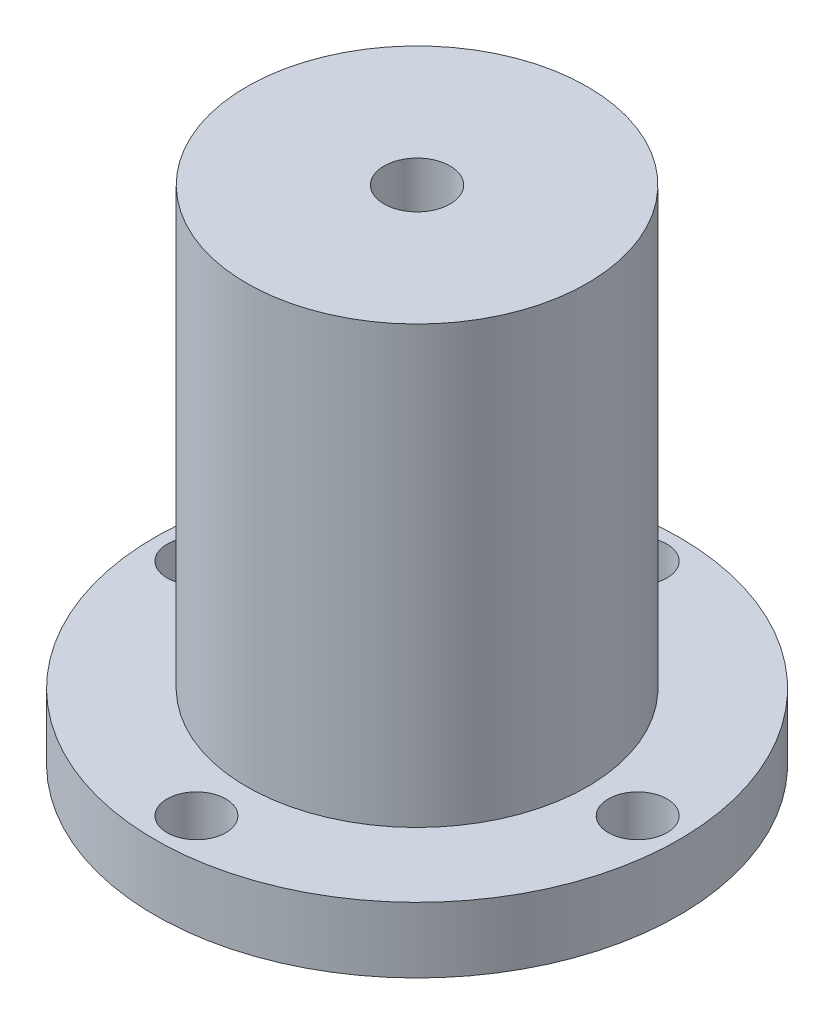
ISO-10303-21;
HEADER;
FILE_DESCRIPTION(('STEP AP214'),'2;1');
FILE_NAME('part.step','',(''),(''),'','','');
FILE_SCHEMA(('AUTOMOTIVE_DESIGN { 1 0 10303 214 1 1 1 1 }'));
ENDSEC;
DATA;
#1=APPLICATION_CONTEXT('core data for automotive mechanical design processes');
#2=APPLICATION_PROTOCOL_DEFINITION('international standard','automotive_design',2000,#1);
#3=PRODUCT_CONTEXT('',#1,'mechanical');
#4=PRODUCT('Part','Part','',(#3));
#5=PRODUCT_RELATED_PRODUCT_CATEGORY('part','',(#4));
#6=PRODUCT_DEFINITION_FORMATION('','',#4);
#7=PRODUCT_DEFINITION_CONTEXT('part definition',#1,'design');
#8=PRODUCT_DEFINITION('design','',#6,#7);
#9=PRODUCT_DEFINITION_SHAPE('','',#8);
#10=(LENGTH_UNIT() NAMED_UNIT(*) SI_UNIT(.MILLI.,.METRE.));
#11=(NAMED_UNIT(*) PLANE_ANGLE_UNIT() SI_UNIT($,.RADIAN.));
#12=(NAMED_UNIT(*) SI_UNIT($,.STERADIAN.) SOLID_ANGLE_UNIT());
#13=UNCERTAINTY_MEASURE_WITH_UNIT(LENGTH_MEASURE(1.E-05),#10,'distance_accuracy_value','');
#14=(GEOMETRIC_REPRESENTATION_CONTEXT(3) GLOBAL_UNCERTAINTY_ASSIGNED_CONTEXT((#13)) GLOBAL_UNIT_ASSIGNED_CONTEXT((#10,
#11,#12)) REPRESENTATION_CONTEXT('',''));
#15=CARTESIAN_POINT('',(0.,0.,0.));
#16=DIRECTION('',(0.,0.,1.));
#17=DIRECTION('',(1.,0.,0.));
#18=AXIS2_PLACEMENT_3D('',#15,#16,#17);
#19=CARTESIAN_POINT('',(12.7,0.,0.));
#20=DIRECTION('',(0.,-1.,0.));
#21=DIRECTION('',(0.,0.,-1.));
#22=AXIS2_PLACEMENT_3D('',#19,#20,#21);
#23=PLANE('',#22);
#24=CARTESIAN_POINT('',(0.,0.,0.));
#25=DIRECTION('',(0.,-1.,0.));
#26=DIRECTION('',(0.,0.,-1.));
#27=AXIS2_PLACEMENT_3D('',#24,#25,#26);
#28=CIRCLE('',#27,5.6007);
#29=CARTESIAN_POINT('',(0.,0.,-5.6007));
#30=VERTEX_POINT('',#29);
#31=EDGE_CURVE('E59',#30,#30,#28,.T.);
#32=ORIENTED_EDGE('',*,*,#31,.F.);
#33=EDGE_LOOP('',(#32));
#34=FACE_BOUND('',#33,.T.);
#35=CARTESIAN_POINT('',(0.,0.,-10.6934));
#36=DIRECTION('',(0.,1.,0.));
#37=DIRECTION('',(0.,0.,1.));
#38=AXIS2_PLACEMENT_3D('',#35,#36,#37);
#39=CIRCLE('',#38,1.4224);
#40=CARTESIAN_POINT('',(0.,0.,-9.271));
#41=VERTEX_POINT('',#40);
#42=EDGE_CURVE('E34',#41,#41,#39,.T.);
#43=ORIENTED_EDGE('',*,*,#42,.T.);
#44=EDGE_LOOP('',(#43));
#45=FACE_BOUND('',#44,.T.);
#46=CARTESIAN_POINT('',(10.6934000000003,0.,-3.02615143814882E-13));
#47=DIRECTION('',(0.,1.,0.));
#48=DIRECTION('',(0.,0.,1.));
#49=AXIS2_PLACEMENT_3D('',#46,#47,#48);
#50=CIRCLE('',#49,1.42240000000024);
#51=CARTESIAN_POINT('',(10.6934000000003,0.,1.42239999999993));
#52=VERTEX_POINT('',#51);
#53=EDGE_CURVE('E51',#52,#52,#50,.T.);
#54=ORIENTED_EDGE('',*,*,#53,.T.);
#55=EDGE_LOOP('',(#54));
#56=FACE_BOUND('',#55,.T.);
#57=CARTESIAN_POINT('',(6.05230287629764E-13,0.,10.6934));
#58=DIRECTION('',(0.,1.,0.));
#59=DIRECTION('',(0.,0.,1.));
#60=AXIS2_PLACEMENT_3D('',#57,#58,#59);
#61=CIRCLE('',#60,1.42240000000065);
#62=CARTESIAN_POINT('',(6.05230287629764E-13,0.,12.1158000000007));
#63=VERTEX_POINT('',#62);
#64=EDGE_CURVE('E45',#63,#63,#61,.T.);
#65=ORIENTED_EDGE('',*,*,#64,.T.);
#66=EDGE_LOOP('',(#65));
#67=FACE_BOUND('',#66,.T.);
#68=CARTESIAN_POINT('',(-10.6933999999997,0.,3.03924707623082E-13));
#69=DIRECTION('',(0.,1.,0.));
#70=DIRECTION('',(0.,0.,1.));
#71=AXIS2_PLACEMENT_3D('',#68,#69,#70);
#72=CIRCLE('',#71,1.42240000000049);
#73=CARTESIAN_POINT('',(-10.6933999999997,0.,1.42240000000079));
#74=VERTEX_POINT('',#73);
#75=EDGE_CURVE('E38',#74,#74,#72,.T.);
#76=ORIENTED_EDGE('',*,*,#75,.T.);
#77=EDGE_LOOP('',(#76));
#78=FACE_BOUND('',#77,.T.);
#79=CARTESIAN_POINT('',(0.,0.,0.));
#80=DIRECTION('',(0.,-1.,0.));
#81=DIRECTION('',(0.,0.,-1.));
#82=AXIS2_PLACEMENT_3D('',#79,#80,#81);
#83=CIRCLE('',#82,12.7);
#84=CARTESIAN_POINT('',(0.,0.,-12.7));
#85=VERTEX_POINT('',#84);
#86=EDGE_CURVE('E31',#85,#85,#83,.T.);
#87=ORIENTED_EDGE('',*,*,#86,.T.);
#88=EDGE_LOOP('',(#87));
#89=FACE_BOUND('',#88,.T.);
#90=ADVANCED_FACE('F15',(#34,#45,#56,#67,#78,#89),#23,.T.);
#91=CARTESIAN_POINT('',(0.,24.3078,0.));
#92=DIRECTION('',(0.,1.,0.));
#93=DIRECTION('',(0.,0.,1.));
#94=AXIS2_PLACEMENT_3D('',#91,#92,#93);
#95=PLANE('',#94);
#96=CARTESIAN_POINT('',(0.,24.3078,0.));
#97=DIRECTION('',(0.,1.,0.));
#98=DIRECTION('',(0.,0.,1.));
#99=AXIS2_PLACEMENT_3D('',#96,#97,#98);
#100=CIRCLE('',#99,1.6002);
#101=CARTESIAN_POINT('',(0.,24.3078,1.6002));
#102=VERTEX_POINT('',#101);
#103=EDGE_CURVE('E64',#102,#102,#100,.T.);
#104=ORIENTED_EDGE('',*,*,#103,.F.);
#105=EDGE_LOOP('',(#104));
#106=FACE_BOUND('',#105,.T.);
#107=CARTESIAN_POINT('',(0.,24.3078,0.));
#108=DIRECTION('',(0.,-1.,0.));
#109=DIRECTION('',(0.,0.,-1.));
#110=AXIS2_PLACEMENT_3D('',#107,#108,#109);
#111=CIRCLE('',#110,8.255);
#112=CARTESIAN_POINT('',(0.,24.3078,-8.255));
#113=VERTEX_POINT('',#112);
#114=EDGE_CURVE('E10',#113,#113,#111,.T.);
#115=ORIENTED_EDGE('',*,*,#114,.F.);
#116=EDGE_LOOP('',(#115));
#117=FACE_BOUND('',#116,.T.);
#118=ADVANCED_FACE('F88',(#106,#117),#95,.T.);
#119=CARTESIAN_POINT('',(0.,0.,0.));
#120=DIRECTION('',(0.,-1.,0.));
#121=DIRECTION('',(0.,0.,-1.));
#122=AXIS2_PLACEMENT_3D('',#119,#120,#121);
#123=CYLINDRICAL_SURFACE('',#122,8.255);
#124=ORIENTED_EDGE('',*,*,#114,.T.);
#125=EDGE_LOOP('',(#124));
#126=FACE_BOUND('',#125,.T.);
#127=CARTESIAN_POINT('',(0.,3.175,0.));
#128=DIRECTION('',(0.,-1.,0.));
#129=DIRECTION('',(0.,0.,-1.));
#130=AXIS2_PLACEMENT_3D('',#127,#128,#129);
#131=CIRCLE('',#130,8.255);
#132=CARTESIAN_POINT('',(0.,3.175,-8.255));
#133=VERTEX_POINT('',#132);
#134=EDGE_CURVE('E22',#133,#133,#131,.T.);
#135=ORIENTED_EDGE('',*,*,#134,.F.);
#136=EDGE_LOOP('',(#135));
#137=FACE_BOUND('',#136,.T.);
#138=ADVANCED_FACE('F114',(#126,#137),#123,.T.);
#139=CARTESIAN_POINT('',(8.255,3.175,0.));
#140=DIRECTION('',(0.,1.,0.));
#141=DIRECTION('',(0.,0.,1.));
#142=AXIS2_PLACEMENT_3D('',#139,#140,#141);
#143=PLANE('',#142);
#144=CARTESIAN_POINT('',(0.,3.175,-10.6934));
#145=DIRECTION('',(0.,1.,0.));
#146=DIRECTION('',(0.,0.,1.));
#147=AXIS2_PLACEMENT_3D('',#144,#145,#146);
#148=CIRCLE('',#147,1.4224);
#149=CARTESIAN_POINT('',(0.,3.175,-9.271));
#150=VERTEX_POINT('',#149);
#151=EDGE_CURVE('E54',#150,#150,#148,.T.);
#152=ORIENTED_EDGE('',*,*,#151,.F.);
#153=EDGE_LOOP('',(#152));
#154=FACE_BOUND('',#153,.T.);
#155=CARTESIAN_POINT('',(10.6934000000003,3.175,-3.02615143814882E-13));
#156=DIRECTION('',(0.,1.,0.));
#157=DIRECTION('',(0.,0.,1.));
#158=AXIS2_PLACEMENT_3D('',#155,#156,#157);
#159=CIRCLE('',#158,1.42240000000024);
#160=CARTESIAN_POINT('',(10.6934000000003,3.175,1.42239999999993));
#161=VERTEX_POINT('',#160);
#162=EDGE_CURVE('E48',#161,#161,#159,.T.);
#163=ORIENTED_EDGE('',*,*,#162,.F.);
#164=EDGE_LOOP('',(#163));
#165=FACE_BOUND('',#164,.T.);
#166=CARTESIAN_POINT('',(6.05230287629764E-13,3.175,10.6934));
#167=DIRECTION('',(0.,1.,0.));
#168=DIRECTION('',(0.,0.,1.));
#169=AXIS2_PLACEMENT_3D('',#166,#167,#168);
#170=CIRCLE('',#169,1.42240000000065);
#171=CARTESIAN_POINT('',(6.05230287629764E-13,3.175,12.1158000000007));
#172=VERTEX_POINT('',#171);
#173=EDGE_CURVE('E42',#172,#172,#170,.T.);
#174=ORIENTED_EDGE('',*,*,#173,.F.);
#175=EDGE_LOOP('',(#174));
#176=FACE_BOUND('',#175,.T.);
#177=CARTESIAN_POINT('',(-10.6933999999997,3.175,3.03924707623082E-13));
#178=DIRECTION('',(0.,1.,0.));
#179=DIRECTION('',(0.,0.,1.));
#180=AXIS2_PLACEMENT_3D('',#177,#178,#179);
#181=CIRCLE('',#180,1.42240000000049);
#182=CARTESIAN_POINT('',(-10.6933999999997,3.175,1.42240000000079));
#183=VERTEX_POINT('',#182);
#184=EDGE_CURVE('E35',#183,#183,#181,.T.);
#185=ORIENTED_EDGE('',*,*,#184,.F.);
#186=EDGE_LOOP('',(#185));
#187=FACE_BOUND('',#186,.T.);
#188=ORIENTED_EDGE('',*,*,#134,.T.);
#189=EDGE_LOOP('',(#188));
#190=FACE_BOUND('',#189,.T.);
#191=CARTESIAN_POINT('',(0.,3.175,0.));
#192=DIRECTION('',(0.,-1.,0.));
#193=DIRECTION('',(0.,0.,-1.));
#194=AXIS2_PLACEMENT_3D('',#191,#192,#193);
#195=CIRCLE('',#194,12.7);
#196=CARTESIAN_POINT('',(0.,3.175,-12.7));
#197=VERTEX_POINT('',#196);
#198=EDGE_CURVE('E26',#197,#197,#195,.T.);
#199=ORIENTED_EDGE('',*,*,#198,.F.);
#200=EDGE_LOOP('',(#199));
#201=FACE_BOUND('',#200,.T.);
#202=ADVANCED_FACE('F102',(#154,#165,#176,#187,#190,#201),#143,.T.);
#203=CARTESIAN_POINT('',(0.,0.,0.));
#204=DIRECTION('',(0.,-1.,0.));
#205=DIRECTION('',(0.,0.,-1.));
#206=AXIS2_PLACEMENT_3D('',#203,#204,#205);
#207=CYLINDRICAL_SURFACE('',#206,12.7);
#208=ORIENTED_EDGE('',*,*,#198,.T.);
#209=EDGE_LOOP('',(#208));
#210=FACE_BOUND('',#209,.T.);
#211=ORIENTED_EDGE('',*,*,#86,.F.);
#212=EDGE_LOOP('',(#211));
#213=FACE_BOUND('',#212,.T.);
#214=ADVANCED_FACE('F99',(#210,#213),#207,.T.);
#215=CARTESIAN_POINT('',(-10.6933999999997,0.,3.03924707623082E-13));
#216=DIRECTION('',(0.,1.,0.));
#217=DIRECTION('',(0.,0.,1.));
#218=AXIS2_PLACEMENT_3D('',#215,#216,#217);
#219=CYLINDRICAL_SURFACE('',#218,1.42240000000049);
#220=ORIENTED_EDGE('',*,*,#75,.F.);
#221=EDGE_LOOP('',(#220));
#222=FACE_BOUND('',#221,.T.);
#223=ORIENTED_EDGE('',*,*,#184,.T.);
#224=EDGE_LOOP('',(#223));
#225=FACE_BOUND('',#224,.T.);
#226=ADVANCED_FACE('F101',(#222,#225),#219,.F.);
#227=CARTESIAN_POINT('',(6.05230287629764E-13,0.,10.6934));
#228=DIRECTION('',(0.,1.,0.));
#229=DIRECTION('',(0.,0.,1.));
#230=AXIS2_PLACEMENT_3D('',#227,#228,#229);
#231=CYLINDRICAL_SURFACE('',#230,1.42240000000065);
#232=ORIENTED_EDGE('',*,*,#64,.F.);
#233=EDGE_LOOP('',(#232));
#234=FACE_BOUND('',#233,.T.);
#235=ORIENTED_EDGE('',*,*,#173,.T.);
#236=EDGE_LOOP('',(#235));
#237=FACE_BOUND('',#236,.T.);
#238=ADVANCED_FACE('F111',(#234,#237),#231,.F.);
#239=CARTESIAN_POINT('',(10.6934000000003,0.,-3.02615143814882E-13));
#240=DIRECTION('',(0.,1.,0.));
#241=DIRECTION('',(0.,0.,1.));
#242=AXIS2_PLACEMENT_3D('',#239,#240,#241);
#243=CYLINDRICAL_SURFACE('',#242,1.42240000000024);
#244=ORIENTED_EDGE('',*,*,#53,.F.);
#245=EDGE_LOOP('',(#244));
#246=FACE_BOUND('',#245,.T.);
#247=ORIENTED_EDGE('',*,*,#162,.T.);
#248=EDGE_LOOP('',(#247));
#249=FACE_BOUND('',#248,.T.);
#250=ADVANCED_FACE('F162',(#246,#249),#243,.F.);
#251=CARTESIAN_POINT('',(0.,0.,-10.6934));
#252=DIRECTION('',(0.,1.,0.));
#253=DIRECTION('',(0.,0.,1.));
#254=AXIS2_PLACEMENT_3D('',#251,#252,#253);
#255=CYLINDRICAL_SURFACE('',#254,1.4224);
#256=ORIENTED_EDGE('',*,*,#42,.F.);
#257=EDGE_LOOP('',(#256));
#258=FACE_BOUND('',#257,.T.);
#259=ORIENTED_EDGE('',*,*,#151,.T.);
#260=EDGE_LOOP('',(#259));
#261=FACE_BOUND('',#260,.T.);
#262=ADVANCED_FACE('F82',(#258,#261),#255,.F.);
#263=CARTESIAN_POINT('',(0.,5.08,0.));
#264=DIRECTION('',(0.,-1.,0.));
#265=DIRECTION('',(0.,0.,-1.));
#266=AXIS2_PLACEMENT_3D('',#263,#264,#265);
#267=CYLINDRICAL_SURFACE('',#266,5.6007);
#268=CARTESIAN_POINT('',(0.,5.08,0.));
#269=DIRECTION('',(0.,-1.,0.));
#270=DIRECTION('',(0.,0.,-1.));
#271=AXIS2_PLACEMENT_3D('',#268,#269,#270);
#272=CIRCLE('',#271,5.6007);
#273=CARTESIAN_POINT('',(0.,5.08,-5.6007));
#274=VERTEX_POINT('',#273);
#275=EDGE_CURVE('E39',#274,#274,#272,.T.);
#276=ORIENTED_EDGE('',*,*,#275,.F.);
#277=EDGE_LOOP('',(#276));
#278=FACE_BOUND('',#277,.T.);
#279=ORIENTED_EDGE('',*,*,#31,.T.);
#280=EDGE_LOOP('',(#279));
#281=FACE_BOUND('',#280,.T.);
#282=ADVANCED_FACE('F76',(#278,#281),#267,.F.);
#283=CARTESIAN_POINT('',(0.,5.08,0.));
#284=DIRECTION('',(0.,-1.,0.));
#285=DIRECTION('',(0.,0.,-1.));
#286=AXIS2_PLACEMENT_3D('',#283,#284,#285);
#287=PLANE('',#286);
#288=CARTESIAN_POINT('',(0.,5.08,0.));
#289=DIRECTION('',(0.,-1.,0.));
#290=DIRECTION('',(0.,0.,-1.));
#291=AXIS2_PLACEMENT_3D('',#288,#289,#290);
#292=CIRCLE('',#291,1.6002);
#293=CARTESIAN_POINT('',(0.,5.08,-1.6002));
#294=VERTEX_POINT('',#293);
#295=EDGE_CURVE('E18',#294,#294,#292,.T.);
#296=ORIENTED_EDGE('',*,*,#295,.F.);
#297=EDGE_LOOP('',(#296));
#298=FACE_BOUND('',#297,.T.);
#299=ORIENTED_EDGE('',*,*,#275,.T.);
#300=EDGE_LOOP('',(#299));
#301=FACE_BOUND('',#300,.T.);
#302=ADVANCED_FACE('F73',(#298,#301),#287,.T.);
#303=CARTESIAN_POINT('',(0.,0.,0.));
#304=DIRECTION('',(0.,1.,0.));
#305=DIRECTION('',(0.,0.,1.));
#306=AXIS2_PLACEMENT_3D('',#303,#304,#305);
#307=CYLINDRICAL_SURFACE('',#306,1.6002);
#308=ORIENTED_EDGE('',*,*,#295,.T.);
#309=EDGE_LOOP('',(#308));
#310=FACE_BOUND('',#309,.T.);
#311=ORIENTED_EDGE('',*,*,#103,.T.);
#312=EDGE_LOOP('',(#311));
#313=FACE_BOUND('',#312,.T.);
#314=ADVANCED_FACE('F71',(#310,#313),#307,.F.);
#315=CLOSED_SHELL('',(#90,#118,#138,#202,#214,#226,#238,#250,#262,#282,#302,#314));
#316=MANIFOLD_SOLID_BREP('B1',#315);
#317=ADVANCED_BREP_SHAPE_REPRESENTATION('',(#18,#316),#14);
#318=SHAPE_DEFINITION_REPRESENTATION(#9,#317);
ENDSEC;
END-ISO-10303-21;
